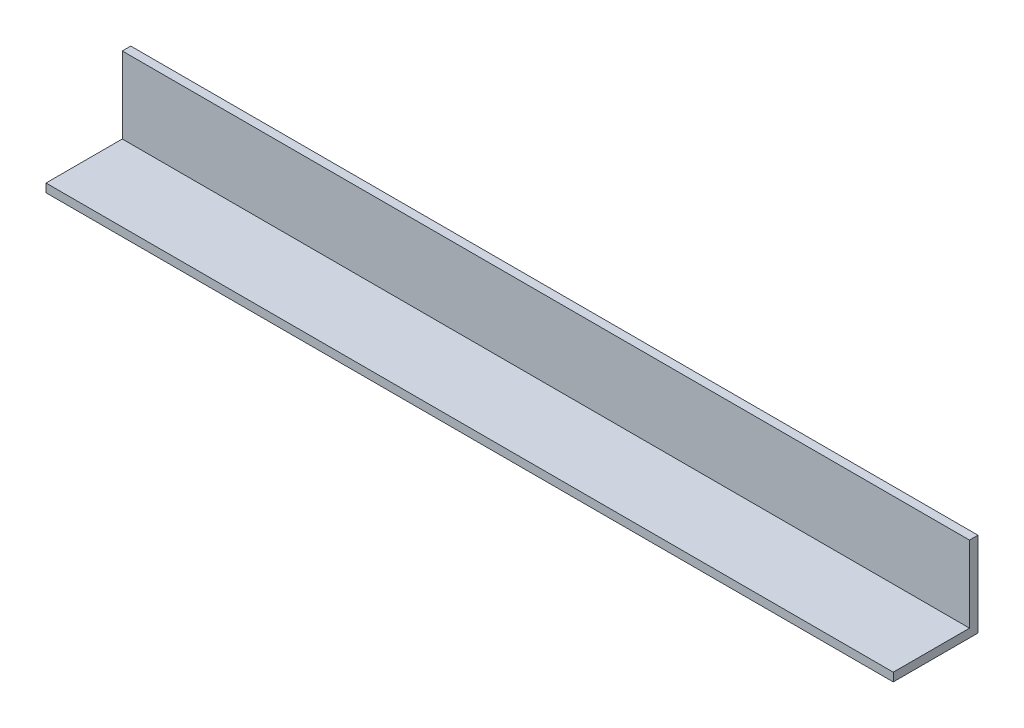
ISO-10303-21;
HEADER;
FILE_DESCRIPTION(('STEP AP214'),'2;1');
FILE_NAME('part.step','',(''),(''),'','','');
FILE_SCHEMA(('AUTOMOTIVE_DESIGN { 1 0 10303 214 1 1 1 1 }'));
ENDSEC;
DATA;
#1=APPLICATION_CONTEXT('core data for automotive mechanical design processes');
#2=APPLICATION_PROTOCOL_DEFINITION('international standard','automotive_design',2000,#1);
#3=PRODUCT_CONTEXT('',#1,'mechanical');
#4=PRODUCT('Part','Part','',(#3));
#5=PRODUCT_RELATED_PRODUCT_CATEGORY('part','',(#4));
#6=PRODUCT_DEFINITION_FORMATION('','',#4);
#7=PRODUCT_DEFINITION_CONTEXT('part definition',#1,'design');
#8=PRODUCT_DEFINITION('design','',#6,#7);
#9=PRODUCT_DEFINITION_SHAPE('','',#8);
#10=(LENGTH_UNIT() NAMED_UNIT(*) SI_UNIT(.MILLI.,.METRE.));
#11=(NAMED_UNIT(*) PLANE_ANGLE_UNIT() SI_UNIT($,.RADIAN.));
#12=(NAMED_UNIT(*) SI_UNIT($,.STERADIAN.) SOLID_ANGLE_UNIT());
#13=UNCERTAINTY_MEASURE_WITH_UNIT(LENGTH_MEASURE(1.E-05),#10,'distance_accuracy_value','');
#14=(GEOMETRIC_REPRESENTATION_CONTEXT(3) GLOBAL_UNCERTAINTY_ASSIGNED_CONTEXT((#13)) GLOBAL_UNIT_ASSIGNED_CONTEXT((#10,
#11,#12)) REPRESENTATION_CONTEXT('',''));
#15=CARTESIAN_POINT('',(0.,0.,0.));
#16=DIRECTION('',(0.,0.,1.));
#17=DIRECTION('',(1.,0.,0.));
#18=AXIS2_PLACEMENT_3D('',#15,#16,#17);
#19=CARTESIAN_POINT('',(150.,0.,0.));
#20=DIRECTION('',(0.,0.,1.));
#21=DIRECTION('',(1.,0.,0.));
#22=AXIS2_PLACEMENT_3D('',#19,#20,#21);
#23=PLANE('',#22);
#24=DIRECTION('',(0.,1.,0.));
#25=VECTOR('',#24,1.);
#26=CARTESIAN_POINT('',(0.,0.,0.));
#27=LINE('',#26,#25);
#28=CARTESIAN_POINT('',(0.,0.,0.));
#29=VERTEX_POINT('',#28);
#30=CARTESIAN_POINT('',(0.,15.,0.));
#31=VERTEX_POINT('',#30);
#32=EDGE_CURVE('E116',#29,#31,#27,.T.);
#33=ORIENTED_EDGE('',*,*,#32,.T.);
#34=DIRECTION('',(-1.,0.,0.));
#35=VECTOR('',#34,1.);
#36=CARTESIAN_POINT('',(150.,15.,0.));
#37=LINE('',#36,#35);
#38=CARTESIAN_POINT('',(150.,15.,0.));
#39=VERTEX_POINT('',#38);
#40=EDGE_CURVE('E11',#39,#31,#37,.T.);
#41=ORIENTED_EDGE('',*,*,#40,.F.);
#42=DIRECTION('',(0.,1.,0.));
#43=VECTOR('',#42,1.);
#44=CARTESIAN_POINT('',(150.,0.,0.));
#45=LINE('',#44,#43);
#46=CARTESIAN_POINT('',(150.,0.,0.));
#47=VERTEX_POINT('',#46);
#48=EDGE_CURVE('E126',#47,#39,#45,.T.);
#49=ORIENTED_EDGE('',*,*,#48,.F.);
#50=DIRECTION('',(-1.,0.,0.));
#51=VECTOR('',#50,1.);
#52=CARTESIAN_POINT('',(150.,0.,0.));
#53=LINE('',#52,#51);
#54=EDGE_CURVE('E112',#47,#29,#53,.T.);
#55=ORIENTED_EDGE('',*,*,#54,.T.);
#56=EDGE_LOOP('',(#33,#41,#49,#55));
#57=FACE_BOUND('',#56,.T.);
#58=ADVANCED_FACE('F32',(#57),#23,.F.);
#59=CARTESIAN_POINT('',(150.,15.,0.));
#60=DIRECTION('',(0.,-1.,0.));
#61=DIRECTION('',(0.,0.,-1.));
#62=AXIS2_PLACEMENT_3D('',#59,#60,#61);
#63=PLANE('',#62);
#64=DIRECTION('',(0.,0.,1.));
#65=VECTOR('',#64,1.);
#66=CARTESIAN_POINT('',(0.,15.,0.));
#67=LINE('',#66,#65);
#68=CARTESIAN_POINT('',(0.,15.,1.5));
#69=VERTEX_POINT('',#68);
#70=EDGE_CURVE('E119',#31,#69,#67,.T.);
#71=ORIENTED_EDGE('',*,*,#70,.T.);
#72=DIRECTION('',(-1.,0.,0.));
#73=VECTOR('',#72,1.);
#74=CARTESIAN_POINT('',(150.,15.,1.5));
#75=LINE('',#74,#73);
#76=CARTESIAN_POINT('',(150.,15.,1.5));
#77=VERTEX_POINT('',#76);
#78=EDGE_CURVE('E40',#77,#69,#75,.T.);
#79=ORIENTED_EDGE('',*,*,#78,.F.);
#80=DIRECTION('',(0.,0.,1.));
#81=VECTOR('',#80,1.);
#82=CARTESIAN_POINT('',(150.,15.,0.));
#83=LINE('',#82,#81);
#84=EDGE_CURVE('E85',#39,#77,#83,.T.);
#85=ORIENTED_EDGE('',*,*,#84,.F.);
#86=ORIENTED_EDGE('',*,*,#40,.T.);
#87=EDGE_LOOP('',(#71,#79,#85,#86));
#88=FACE_BOUND('',#87,.T.);
#89=ADVANCED_FACE('F150',(#88),#63,.F.);
#90=CARTESIAN_POINT('',(150.,1.5,1.5));
#91=DIRECTION('',(0.,0.,-1.));
#92=DIRECTION('',(-1.,0.,0.));
#93=AXIS2_PLACEMENT_3D('',#90,#91,#92);
#94=PLANE('',#93);
#95=DIRECTION('',(0.,-1.,0.));
#96=VECTOR('',#95,1.);
#97=CARTESIAN_POINT('',(0.,1.5,1.5));
#98=LINE('',#97,#96);
#99=CARTESIAN_POINT('',(0.,1.5,1.5));
#100=VERTEX_POINT('',#99);
#101=EDGE_CURVE('E121',#69,#100,#98,.T.);
#102=ORIENTED_EDGE('',*,*,#101,.T.);
#103=DIRECTION('',(-1.,0.,0.));
#104=VECTOR('',#103,1.);
#105=CARTESIAN_POINT('',(150.,1.5,1.5));
#106=LINE('',#105,#104);
#107=CARTESIAN_POINT('',(150.,1.5,1.5));
#108=VERTEX_POINT('',#107);
#109=EDGE_CURVE('E107',#108,#100,#106,.T.);
#110=ORIENTED_EDGE('',*,*,#109,.F.);
#111=DIRECTION('',(0.,-1.,0.));
#112=VECTOR('',#111,1.);
#113=CARTESIAN_POINT('',(150.,1.5,1.5));
#114=LINE('',#113,#112);
#115=EDGE_CURVE('E98',#77,#108,#114,.T.);
#116=ORIENTED_EDGE('',*,*,#115,.F.);
#117=ORIENTED_EDGE('',*,*,#78,.T.);
#118=EDGE_LOOP('',(#102,#110,#116,#117));
#119=FACE_BOUND('',#118,.T.);
#120=ADVANCED_FACE('F132',(#119),#94,.F.);
#121=CARTESIAN_POINT('',(150.,1.5,1.5));
#122=DIRECTION('',(0.,-1.,0.));
#123=DIRECTION('',(0.,0.,-1.));
#124=AXIS2_PLACEMENT_3D('',#121,#122,#123);
#125=PLANE('',#124);
#126=DIRECTION('',(0.,0.,1.));
#127=VECTOR('',#126,1.);
#128=CARTESIAN_POINT('',(0.,1.5,1.5));
#129=LINE('',#128,#127);
#130=CARTESIAN_POINT('',(0.,1.5,15.));
#131=VERTEX_POINT('',#130);
#132=EDGE_CURVE('E106',#100,#131,#129,.T.);
#133=ORIENTED_EDGE('',*,*,#132,.T.);
#134=DIRECTION('',(-1.,0.,0.));
#135=VECTOR('',#134,1.);
#136=CARTESIAN_POINT('',(150.,1.5,15.));
#137=LINE('',#136,#135);
#138=CARTESIAN_POINT('',(150.,1.5,15.));
#139=VERTEX_POINT('',#138);
#140=EDGE_CURVE('E103',#139,#131,#137,.T.);
#141=ORIENTED_EDGE('',*,*,#140,.F.);
#142=DIRECTION('',(0.,0.,1.));
#143=VECTOR('',#142,1.);
#144=CARTESIAN_POINT('',(150.,1.5,1.5));
#145=LINE('',#144,#143);
#146=EDGE_CURVE('E92',#108,#139,#145,.T.);
#147=ORIENTED_EDGE('',*,*,#146,.F.);
#148=ORIENTED_EDGE('',*,*,#109,.T.);
#149=EDGE_LOOP('',(#133,#141,#147,#148));
#150=FACE_BOUND('',#149,.T.);
#151=ADVANCED_FACE('F104',(#150),#125,.F.);
#152=CARTESIAN_POINT('',(150.,0.,15.));
#153=DIRECTION('',(0.,0.,-1.));
#154=DIRECTION('',(-1.,0.,0.));
#155=AXIS2_PLACEMENT_3D('',#152,#153,#154);
#156=PLANE('',#155);
#157=DIRECTION('',(0.,-1.,0.));
#158=VECTOR('',#157,1.);
#159=CARTESIAN_POINT('',(0.,0.,15.));
#160=LINE('',#159,#158);
#161=CARTESIAN_POINT('',(0.,0.,15.));
#162=VERTEX_POINT('',#161);
#163=EDGE_CURVE('E71',#131,#162,#160,.T.);
#164=ORIENTED_EDGE('',*,*,#163,.T.);
#165=DIRECTION('',(-1.,0.,0.));
#166=VECTOR('',#165,1.);
#167=CARTESIAN_POINT('',(150.,0.,15.));
#168=LINE('',#167,#166);
#169=CARTESIAN_POINT('',(150.,0.,15.));
#170=VERTEX_POINT('',#169);
#171=EDGE_CURVE('E108',#170,#162,#168,.T.);
#172=ORIENTED_EDGE('',*,*,#171,.F.);
#173=DIRECTION('',(0.,-1.,0.));
#174=VECTOR('',#173,1.);
#175=CARTESIAN_POINT('',(150.,0.,15.));
#176=LINE('',#175,#174);
#177=EDGE_CURVE('E96',#139,#170,#176,.T.);
#178=ORIENTED_EDGE('',*,*,#177,.F.);
#179=ORIENTED_EDGE('',*,*,#140,.T.);
#180=EDGE_LOOP('',(#164,#172,#178,#179));
#181=FACE_BOUND('',#180,.T.);
#182=ADVANCED_FACE('F110',(#181),#156,.F.);
#183=CARTESIAN_POINT('',(150.,0.,0.));
#184=DIRECTION('',(0.,1.,0.));
#185=DIRECTION('',(0.,0.,1.));
#186=AXIS2_PLACEMENT_3D('',#183,#184,#185);
#187=PLANE('',#186);
#188=DIRECTION('',(0.,0.,-1.));
#189=VECTOR('',#188,1.);
#190=CARTESIAN_POINT('',(0.,0.,0.));
#191=LINE('',#190,#189);
#192=EDGE_CURVE('E77',#162,#29,#191,.T.);
#193=ORIENTED_EDGE('',*,*,#192,.T.);
#194=ORIENTED_EDGE('',*,*,#54,.F.);
#195=DIRECTION('',(0.,0.,-1.));
#196=VECTOR('',#195,1.);
#197=CARTESIAN_POINT('',(150.,0.,0.));
#198=LINE('',#197,#196);
#199=EDGE_CURVE('E48',#170,#47,#198,.T.);
#200=ORIENTED_EDGE('',*,*,#199,.F.);
#201=ORIENTED_EDGE('',*,*,#171,.T.);
#202=EDGE_LOOP('',(#193,#194,#200,#201));
#203=FACE_BOUND('',#202,.T.);
#204=ADVANCED_FACE('F139',(#203),#187,.F.);
#205=CARTESIAN_POINT('',(150.,0.,0.));
#206=DIRECTION('',(1.,0.,0.));
#207=DIRECTION('',(0.,0.,-1.));
#208=AXIS2_PLACEMENT_3D('',#205,#206,#207);
#209=PLANE('',#208);
#210=ORIENTED_EDGE('',*,*,#48,.T.);
#211=ORIENTED_EDGE('',*,*,#84,.T.);
#212=ORIENTED_EDGE('',*,*,#115,.T.);
#213=ORIENTED_EDGE('',*,*,#146,.T.);
#214=ORIENTED_EDGE('',*,*,#177,.T.);
#215=ORIENTED_EDGE('',*,*,#199,.T.);
#216=EDGE_LOOP('',(#210,#211,#212,#213,#214,#215));
#217=FACE_BOUND('',#216,.T.);
#218=ADVANCED_FACE('F94',(#217),#209,.T.);
#219=CARTESIAN_POINT('',(0.,0.,0.));
#220=DIRECTION('',(1.,0.,0.));
#221=DIRECTION('',(0.,0.,-1.));
#222=AXIS2_PLACEMENT_3D('',#219,#220,#221);
#223=PLANE('',#222);
#224=ORIENTED_EDGE('',*,*,#32,.F.);
#225=ORIENTED_EDGE('',*,*,#192,.F.);
#226=ORIENTED_EDGE('',*,*,#163,.F.);
#227=ORIENTED_EDGE('',*,*,#132,.F.);
#228=ORIENTED_EDGE('',*,*,#101,.F.);
#229=ORIENTED_EDGE('',*,*,#70,.F.);
#230=EDGE_LOOP('',(#224,#225,#226,#227,#228,#229));
#231=FACE_BOUND('',#230,.T.);
#232=ADVANCED_FACE('F135',(#231),#223,.F.);
#233=CLOSED_SHELL('',(#58,#89,#120,#151,#182,#204,#218,#232));
#234=MANIFOLD_SOLID_BREP('B2',#233);
#235=ADVANCED_BREP_SHAPE_REPRESENTATION('',(#18,#234),#14);
#236=SHAPE_DEFINITION_REPRESENTATION(#9,#235);
ENDSEC;
END-ISO-10303-21;
